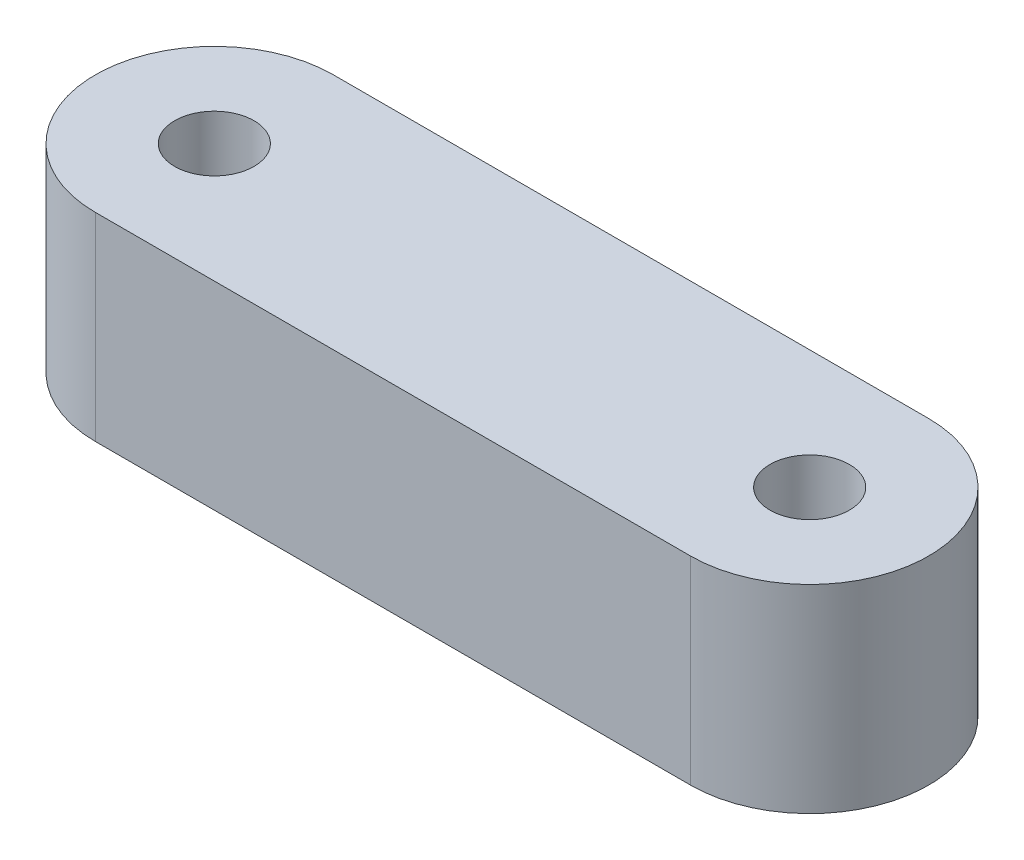
ISO-10303-21;
HEADER;
FILE_DESCRIPTION(('STEP AP214'),'2;1');
FILE_NAME('part.step','',(''),(''),'','','');
FILE_SCHEMA(('AUTOMOTIVE_DESIGN { 1 0 10303 214 1 1 1 1 }'));
ENDSEC;
DATA;
#1=APPLICATION_CONTEXT('core data for automotive mechanical design processes');
#2=APPLICATION_PROTOCOL_DEFINITION('international standard','automotive_design',2000,#1);
#3=PRODUCT_CONTEXT('',#1,'mechanical');
#4=PRODUCT('Part','Part','',(#3));
#5=PRODUCT_RELATED_PRODUCT_CATEGORY('part','',(#4));
#6=PRODUCT_DEFINITION_FORMATION('','',#4);
#7=PRODUCT_DEFINITION_CONTEXT('part definition',#1,'design');
#8=PRODUCT_DEFINITION('design','',#6,#7);
#9=PRODUCT_DEFINITION_SHAPE('','',#8);
#10=(LENGTH_UNIT() NAMED_UNIT(*) SI_UNIT(.MILLI.,.METRE.));
#11=(NAMED_UNIT(*) PLANE_ANGLE_UNIT() SI_UNIT($,.RADIAN.));
#12=(NAMED_UNIT(*) SI_UNIT($,.STERADIAN.) SOLID_ANGLE_UNIT());
#13=UNCERTAINTY_MEASURE_WITH_UNIT(LENGTH_MEASURE(1.E-05),#10,'distance_accuracy_value','');
#14=(GEOMETRIC_REPRESENTATION_CONTEXT(3) GLOBAL_UNCERTAINTY_ASSIGNED_CONTEXT((#13)) GLOBAL_UNIT_ASSIGNED_CONTEXT((#10,
#11,#12)) REPRESENTATION_CONTEXT('',''));
#15=CARTESIAN_POINT('',(0.,0.,0.));
#16=DIRECTION('',(0.,0.,1.));
#17=DIRECTION('',(1.,0.,0.));
#18=AXIS2_PLACEMENT_3D('',#15,#16,#17);
#19=CARTESIAN_POINT('',(-63.5,12.7,0.));
#20=DIRECTION('',(0.,-1.,0.));
#21=DIRECTION('',(0.,0.,-1.));
#22=AXIS2_PLACEMENT_3D('',#19,#20,#21);
#23=CYLINDRICAL_SURFACE('',#22,7.62);
#24=CARTESIAN_POINT('',(-63.5,0.,0.));
#25=DIRECTION('',(0.,1.,0.));
#26=DIRECTION('',(0.,0.,1.));
#27=AXIS2_PLACEMENT_3D('',#24,#25,#26);
#28=CIRCLE('',#27,7.62);
#29=CARTESIAN_POINT('',(-63.5,0.,-7.62));
#30=VERTEX_POINT('',#29);
#31=CARTESIAN_POINT('',(-63.5,0.,7.62));
#32=VERTEX_POINT('',#31);
#33=EDGE_CURVE('E102',#30,#32,#28,.T.);
#34=ORIENTED_EDGE('',*,*,#33,.T.);
#35=DIRECTION('',(0.,-1.,0.));
#36=VECTOR('',#35,1.);
#37=CARTESIAN_POINT('',(-63.5,12.7,7.62));
#38=LINE('',#37,#36);
#39=CARTESIAN_POINT('',(-63.5,12.7,7.62));
#40=VERTEX_POINT('',#39);
#41=EDGE_CURVE('E11',#40,#32,#38,.T.);
#42=ORIENTED_EDGE('',*,*,#41,.F.);
#43=CARTESIAN_POINT('',(-63.5,12.7,0.));
#44=DIRECTION('',(0.,1.,0.));
#45=DIRECTION('',(0.,0.,1.));
#46=AXIS2_PLACEMENT_3D('',#43,#44,#45);
#47=CIRCLE('',#46,7.62);
#48=CARTESIAN_POINT('',(-63.5,12.7,-7.62));
#49=VERTEX_POINT('',#48);
#50=EDGE_CURVE('E90',#49,#40,#47,.T.);
#51=ORIENTED_EDGE('',*,*,#50,.F.);
#52=DIRECTION('',(0.,-1.,0.));
#53=VECTOR('',#52,1.);
#54=CARTESIAN_POINT('',(-63.5,12.7,-7.62));
#55=LINE('',#54,#53);
#56=EDGE_CURVE('E98',#49,#30,#55,.T.);
#57=ORIENTED_EDGE('',*,*,#56,.T.);
#58=EDGE_LOOP('',(#34,#42,#51,#57));
#59=FACE_BOUND('',#58,.T.);
#60=ADVANCED_FACE('F39',(#59),#23,.T.);
#61=CARTESIAN_POINT('',(-63.5,12.7,7.62));
#62=DIRECTION('',(0.,0.,-1.));
#63=DIRECTION('',(-1.,0.,0.));
#64=AXIS2_PLACEMENT_3D('',#61,#62,#63);
#65=PLANE('',#64);
#66=DIRECTION('',(1.,0.,0.));
#67=VECTOR('',#66,1.);
#68=CARTESIAN_POINT('',(-63.5,0.,7.62));
#69=LINE('',#68,#67);
#70=CARTESIAN_POINT('',(-25.4,0.,7.62));
#71=VERTEX_POINT('',#70);
#72=EDGE_CURVE('E94',#32,#71,#69,.T.);
#73=ORIENTED_EDGE('',*,*,#72,.T.);
#74=DIRECTION('',(0.,-1.,0.));
#75=VECTOR('',#74,1.);
#76=CARTESIAN_POINT('',(-25.4,12.7,7.62));
#77=LINE('',#76,#75);
#78=CARTESIAN_POINT('',(-25.4,12.7,7.62));
#79=VERTEX_POINT('',#78);
#80=EDGE_CURVE('E47',#79,#71,#77,.T.);
#81=ORIENTED_EDGE('',*,*,#80,.F.);
#82=DIRECTION('',(1.,0.,0.));
#83=VECTOR('',#82,1.);
#84=CARTESIAN_POINT('',(-63.5,12.7,7.62));
#85=LINE('',#84,#83);
#86=EDGE_CURVE('E85',#40,#79,#85,.T.);
#87=ORIENTED_EDGE('',*,*,#86,.F.);
#88=ORIENTED_EDGE('',*,*,#41,.T.);
#89=EDGE_LOOP('',(#73,#81,#87,#88));
#90=FACE_BOUND('',#89,.T.);
#91=ADVANCED_FACE('F93',(#90),#65,.F.);
#92=CARTESIAN_POINT('',(-25.4,12.7,0.));
#93=DIRECTION('',(0.,-1.,0.));
#94=DIRECTION('',(0.,0.,-1.));
#95=AXIS2_PLACEMENT_3D('',#92,#93,#94);
#96=CYLINDRICAL_SURFACE('',#95,7.62);
#97=CARTESIAN_POINT('',(-25.4,0.,0.));
#98=DIRECTION('',(0.,1.,0.));
#99=DIRECTION('',(0.,0.,1.));
#100=AXIS2_PLACEMENT_3D('',#97,#98,#99);
#101=CIRCLE('',#100,7.62);
#102=CARTESIAN_POINT('',(-25.4,0.,-7.62));
#103=VERTEX_POINT('',#102);
#104=EDGE_CURVE('E72',#71,#103,#101,.T.);
#105=ORIENTED_EDGE('',*,*,#104,.T.);
#106=DIRECTION('',(0.,-1.,0.));
#107=VECTOR('',#106,1.);
#108=CARTESIAN_POINT('',(-25.4,12.7,-7.62));
#109=LINE('',#108,#107);
#110=CARTESIAN_POINT('',(-25.4,12.7,-7.62));
#111=VERTEX_POINT('',#110);
#112=EDGE_CURVE('E95',#111,#103,#109,.T.);
#113=ORIENTED_EDGE('',*,*,#112,.F.);
#114=CARTESIAN_POINT('',(-25.4,12.7,0.));
#115=DIRECTION('',(0.,1.,0.));
#116=DIRECTION('',(0.,0.,1.));
#117=AXIS2_PLACEMENT_3D('',#114,#115,#116);
#118=CIRCLE('',#117,7.62);
#119=EDGE_CURVE('E88',#79,#111,#118,.T.);
#120=ORIENTED_EDGE('',*,*,#119,.F.);
#121=ORIENTED_EDGE('',*,*,#80,.T.);
#122=EDGE_LOOP('',(#105,#113,#120,#121));
#123=FACE_BOUND('',#122,.T.);
#124=ADVANCED_FACE('F96',(#123),#96,.T.);
#125=CARTESIAN_POINT('',(-63.5,12.7,-7.62));
#126=DIRECTION('',(0.,0.,1.));
#127=DIRECTION('',(1.,0.,0.));
#128=AXIS2_PLACEMENT_3D('',#125,#126,#127);
#129=PLANE('',#128);
#130=DIRECTION('',(-1.,0.,0.));
#131=VECTOR('',#130,1.);
#132=CARTESIAN_POINT('',(-63.5,0.,-7.62));
#133=LINE('',#132,#131);
#134=EDGE_CURVE('E78',#103,#30,#133,.T.);
#135=ORIENTED_EDGE('',*,*,#134,.T.);
#136=ORIENTED_EDGE('',*,*,#56,.F.);
#137=DIRECTION('',(-1.,0.,0.));
#138=VECTOR('',#137,1.);
#139=CARTESIAN_POINT('',(-63.5,12.7,-7.62));
#140=LINE('',#139,#138);
#141=EDGE_CURVE('E55',#111,#49,#140,.T.);
#142=ORIENTED_EDGE('',*,*,#141,.F.);
#143=ORIENTED_EDGE('',*,*,#112,.T.);
#144=EDGE_LOOP('',(#135,#136,#142,#143));
#145=FACE_BOUND('',#144,.T.);
#146=ADVANCED_FACE('F110',(#145),#129,.F.);
#147=CARTESIAN_POINT('',(-63.5,12.7,0.));
#148=DIRECTION('',(0.,1.,0.));
#149=DIRECTION('',(0.,0.,1.));
#150=AXIS2_PLACEMENT_3D('',#147,#148,#149);
#151=PLANE('',#150);
#152=CARTESIAN_POINT('',(-63.5,12.7,0.));
#153=DIRECTION('',(0.,1.,0.));
#154=DIRECTION('',(0.,0.,1.));
#155=AXIS2_PLACEMENT_3D('',#152,#153,#154);
#156=CIRCLE('',#155,2.54);
#157=CARTESIAN_POINT('',(-63.5,12.7,2.54));
#158=VERTEX_POINT('',#157);
#159=EDGE_CURVE('E122',#158,#158,#156,.T.);
#160=ORIENTED_EDGE('',*,*,#159,.F.);
#161=EDGE_LOOP('',(#160));
#162=FACE_BOUND('',#161,.T.);
#163=CARTESIAN_POINT('',(-25.4,12.7,0.));
#164=DIRECTION('',(0.,1.,0.));
#165=DIRECTION('',(0.,0.,-1.));
#166=AXIS2_PLACEMENT_3D('',#163,#164,#165);
#167=CIRCLE('',#166,2.54);
#168=CARTESIAN_POINT('',(-25.4,12.7,-2.54));
#169=VERTEX_POINT('',#168);
#170=EDGE_CURVE('E119',#169,#169,#167,.T.);
#171=ORIENTED_EDGE('',*,*,#170,.F.);
#172=EDGE_LOOP('',(#171));
#173=FACE_BOUND('',#172,.T.);
#174=ORIENTED_EDGE('',*,*,#50,.T.);
#175=ORIENTED_EDGE('',*,*,#86,.T.);
#176=ORIENTED_EDGE('',*,*,#119,.T.);
#177=ORIENTED_EDGE('',*,*,#141,.T.);
#178=EDGE_LOOP('',(#174,#175,#176,#177));
#179=FACE_BOUND('',#178,.T.);
#180=ADVANCED_FACE('F86',(#162,#173,#179),#151,.T.);
#181=CARTESIAN_POINT('',(-63.5,0.,0.));
#182=DIRECTION('',(0.,1.,0.));
#183=DIRECTION('',(0.,0.,1.));
#184=AXIS2_PLACEMENT_3D('',#181,#182,#183);
#185=PLANE('',#184);
#186=CARTESIAN_POINT('',(-63.5,0.,0.));
#187=DIRECTION('',(0.,1.,0.));
#188=DIRECTION('',(0.,0.,1.));
#189=AXIS2_PLACEMENT_3D('',#186,#187,#188);
#190=CIRCLE('',#189,2.54);
#191=CARTESIAN_POINT('',(-63.5,0.,2.54));
#192=VERTEX_POINT('',#191);
#193=EDGE_CURVE('E105',#192,#192,#190,.T.);
#194=ORIENTED_EDGE('',*,*,#193,.T.);
#195=EDGE_LOOP('',(#194));
#196=FACE_BOUND('',#195,.T.);
#197=CARTESIAN_POINT('',(-25.4,0.,0.));
#198=DIRECTION('',(0.,1.,0.));
#199=DIRECTION('',(0.,0.,-1.));
#200=AXIS2_PLACEMENT_3D('',#197,#198,#199);
#201=CIRCLE('',#200,2.54);
#202=CARTESIAN_POINT('',(-25.4,0.,-2.54));
#203=VERTEX_POINT('',#202);
#204=EDGE_CURVE('E116',#203,#203,#201,.T.);
#205=ORIENTED_EDGE('',*,*,#204,.T.);
#206=EDGE_LOOP('',(#205));
#207=FACE_BOUND('',#206,.T.);
#208=ORIENTED_EDGE('',*,*,#33,.F.);
#209=ORIENTED_EDGE('',*,*,#134,.F.);
#210=ORIENTED_EDGE('',*,*,#104,.F.);
#211=ORIENTED_EDGE('',*,*,#72,.F.);
#212=EDGE_LOOP('',(#208,#209,#210,#211));
#213=FACE_BOUND('',#212,.T.);
#214=ADVANCED_FACE('F113',(#196,#207,#213),#185,.F.);
#215=CARTESIAN_POINT('',(-25.4,0.,0.));
#216=DIRECTION('',(0.,1.,0.));
#217=DIRECTION('',(0.,0.,1.));
#218=AXIS2_PLACEMENT_3D('',#215,#216,#217);
#219=CYLINDRICAL_SURFACE('',#218,2.54);
#220=ORIENTED_EDGE('',*,*,#204,.F.);
#221=EDGE_LOOP('',(#220));
#222=FACE_BOUND('',#221,.T.);
#223=ORIENTED_EDGE('',*,*,#170,.T.);
#224=EDGE_LOOP('',(#223));
#225=FACE_BOUND('',#224,.T.);
#226=ADVANCED_FACE('F133',(#222,#225),#219,.F.);
#227=CARTESIAN_POINT('',(-63.5,0.,0.));
#228=DIRECTION('',(0.,1.,0.));
#229=DIRECTION('',(0.,0.,1.));
#230=AXIS2_PLACEMENT_3D('',#227,#228,#229);
#231=CYLINDRICAL_SURFACE('',#230,2.54);
#232=ORIENTED_EDGE('',*,*,#193,.F.);
#233=EDGE_LOOP('',(#232));
#234=FACE_BOUND('',#233,.T.);
#235=ORIENTED_EDGE('',*,*,#159,.T.);
#236=EDGE_LOOP('',(#235));
#237=FACE_BOUND('',#236,.T.);
#238=ADVANCED_FACE('F130',(#234,#237),#231,.F.);
#239=CLOSED_SHELL('',(#60,#91,#124,#146,#180,#214,#226,#238));
#240=MANIFOLD_SOLID_BREP('B2',#239);
#241=ADVANCED_BREP_SHAPE_REPRESENTATION('',(#18,#240),#14);
#242=SHAPE_DEFINITION_REPRESENTATION(#9,#241);
ENDSEC;
END-ISO-10303-21;
